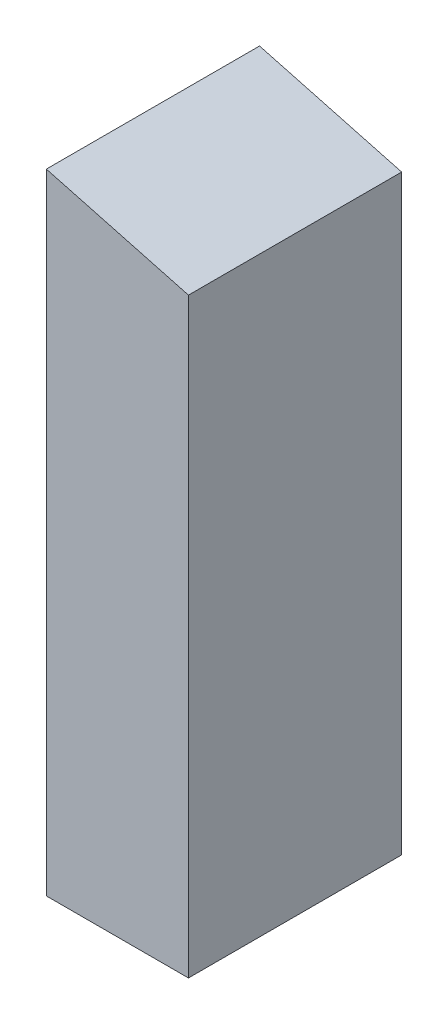
ISO-10303-21;
HEADER;
FILE_DESCRIPTION(('STEP AP214'),'2;1');
FILE_NAME('part.step','',(''),(''),'','','');
FILE_SCHEMA(('AUTOMOTIVE_DESIGN { 1 0 10303 214 1 1 1 1 }'));
ENDSEC;
DATA;
#1=APPLICATION_CONTEXT('core data for automotive mechanical design processes');
#2=APPLICATION_PROTOCOL_DEFINITION('international standard','automotive_design',2000,#1);
#3=PRODUCT_CONTEXT('',#1,'mechanical');
#4=PRODUCT('Part','Part','',(#3));
#5=PRODUCT_RELATED_PRODUCT_CATEGORY('part','',(#4));
#6=PRODUCT_DEFINITION_FORMATION('','',#4);
#7=PRODUCT_DEFINITION_CONTEXT('part definition',#1,'design');
#8=PRODUCT_DEFINITION('design','',#6,#7);
#9=PRODUCT_DEFINITION_SHAPE('','',#8);
#10=(LENGTH_UNIT() NAMED_UNIT(*) SI_UNIT(.MILLI.,.METRE.));
#11=(NAMED_UNIT(*) PLANE_ANGLE_UNIT() SI_UNIT($,.RADIAN.));
#12=(NAMED_UNIT(*) SI_UNIT($,.STERADIAN.) SOLID_ANGLE_UNIT());
#13=UNCERTAINTY_MEASURE_WITH_UNIT(LENGTH_MEASURE(1.E-05),#10,'distance_accuracy_value','');
#14=(GEOMETRIC_REPRESENTATION_CONTEXT(3) GLOBAL_UNCERTAINTY_ASSIGNED_CONTEXT((#13)) GLOBAL_UNIT_ASSIGNED_CONTEXT((#10,
#11,#12)) REPRESENTATION_CONTEXT('',''));
#15=CARTESIAN_POINT('',(0.,0.,0.));
#16=DIRECTION('',(0.,0.,1.));
#17=DIRECTION('',(1.,0.,0.));
#18=AXIS2_PLACEMENT_3D('',#15,#16,#17);
#19=CARTESIAN_POINT('',(0.,0.,76.2));
#20=DIRECTION('',(0.,1.,0.));
#21=DIRECTION('',(0.,0.,1.));
#22=AXIS2_PLACEMENT_3D('',#19,#20,#21);
#23=PLANE('',#22);
#24=DIRECTION('',(1.,0.,0.));
#25=VECTOR('',#24,1.);
#26=CARTESIAN_POINT('',(0.,0.,0.));
#27=LINE('',#26,#25);
#28=CARTESIAN_POINT('',(0.,0.,0.));
#29=VERTEX_POINT('',#28);
#30=CARTESIAN_POINT('',(50.8,0.,0.));
#31=VERTEX_POINT('',#30);
#32=EDGE_CURVE('E100',#29,#31,#27,.T.);
#33=ORIENTED_EDGE('',*,*,#32,.T.);
#34=DIRECTION('',(0.,0.,-1.));
#35=VECTOR('',#34,1.);
#36=CARTESIAN_POINT('',(50.8,0.,76.2));
#37=LINE('',#36,#35);
#38=CARTESIAN_POINT('',(50.8,0.,76.2));
#39=VERTEX_POINT('',#38);
#40=EDGE_CURVE('E11',#39,#31,#37,.T.);
#41=ORIENTED_EDGE('',*,*,#40,.F.);
#42=DIRECTION('',(1.,0.,0.));
#43=VECTOR('',#42,1.);
#44=CARTESIAN_POINT('',(0.,0.,76.2));
#45=LINE('',#44,#43);
#46=CARTESIAN_POINT('',(0.,0.,76.2));
#47=VERTEX_POINT('',#46);
#48=EDGE_CURVE('E88',#47,#39,#45,.T.);
#49=ORIENTED_EDGE('',*,*,#48,.F.);
#50=DIRECTION('',(0.,0.,-1.));
#51=VECTOR('',#50,1.);
#52=CARTESIAN_POINT('',(0.,0.,76.2));
#53=LINE('',#52,#51);
#54=EDGE_CURVE('E96',#47,#29,#53,.T.);
#55=ORIENTED_EDGE('',*,*,#54,.T.);
#56=EDGE_LOOP('',(#33,#41,#49,#55));
#57=FACE_BOUND('',#56,.T.);
#58=ADVANCED_FACE('F37',(#57),#23,.F.);
#59=CARTESIAN_POINT('',(50.8,0.,76.2));
#60=DIRECTION('',(-1.,0.,0.));
#61=DIRECTION('',(0.,0.,1.));
#62=AXIS2_PLACEMENT_3D('',#59,#60,#61);
#63=PLANE('',#62);
#64=DIRECTION('',(0.,1.,0.));
#65=VECTOR('',#64,1.);
#66=CARTESIAN_POINT('',(50.8,0.,0.));
#67=LINE('',#66,#65);
#68=CARTESIAN_POINT('',(50.8,211.388181024499,0.));
#69=VERTEX_POINT('',#68);
#70=EDGE_CURVE('E92',#31,#69,#67,.T.);
#71=ORIENTED_EDGE('',*,*,#70,.T.);
#72=DIRECTION('',(0.,0.,-1.));
#73=VECTOR('',#72,1.);
#74=CARTESIAN_POINT('',(50.8,211.388181024499,76.2));
#75=LINE('',#74,#73);
#76=CARTESIAN_POINT('',(50.8,211.388181024499,76.2));
#77=VERTEX_POINT('',#76);
#78=EDGE_CURVE('E45',#77,#69,#75,.T.);
#79=ORIENTED_EDGE('',*,*,#78,.F.);
#80=DIRECTION('',(0.,1.,0.));
#81=VECTOR('',#80,1.);
#82=CARTESIAN_POINT('',(50.8,0.,76.2));
#83=LINE('',#82,#81);
#84=EDGE_CURVE('E83',#39,#77,#83,.T.);
#85=ORIENTED_EDGE('',*,*,#84,.F.);
#86=ORIENTED_EDGE('',*,*,#40,.T.);
#87=EDGE_LOOP('',(#71,#79,#85,#86));
#88=FACE_BOUND('',#87,.T.);
#89=ADVANCED_FACE('F91',(#88),#63,.F.);
#90=CARTESIAN_POINT('',(0.,225.,76.2));
#91=DIRECTION('',(-0.258819045102525,-0.965925826289067,0.));
#92=DIRECTION('',(0.965925826289067,-0.258819045102525,0.));
#93=AXIS2_PLACEMENT_3D('',#90,#91,#92);
#94=PLANE('',#93);
#95=DIRECTION('',(-0.965925826289067,0.258819045102525,0.));
#96=VECTOR('',#95,1.);
#97=CARTESIAN_POINT('',(0.,225.,0.));
#98=LINE('',#97,#96);
#99=CARTESIAN_POINT('',(0.,225.,0.));
#100=VERTEX_POINT('',#99);
#101=EDGE_CURVE('E70',#69,#100,#98,.T.);
#102=ORIENTED_EDGE('',*,*,#101,.T.);
#103=DIRECTION('',(0.,0.,-1.));
#104=VECTOR('',#103,1.);
#105=CARTESIAN_POINT('',(0.,225.,76.2));
#106=LINE('',#105,#104);
#107=CARTESIAN_POINT('',(0.,225.,76.2));
#108=VERTEX_POINT('',#107);
#109=EDGE_CURVE('E93',#108,#100,#106,.T.);
#110=ORIENTED_EDGE('',*,*,#109,.F.);
#111=DIRECTION('',(-0.965925826289067,0.258819045102525,0.));
#112=VECTOR('',#111,1.);
#113=CARTESIAN_POINT('',(0.,225.,76.2));
#114=LINE('',#113,#112);
#115=EDGE_CURVE('E86',#77,#108,#114,.T.);
#116=ORIENTED_EDGE('',*,*,#115,.F.);
#117=ORIENTED_EDGE('',*,*,#78,.T.);
#118=EDGE_LOOP('',(#102,#110,#116,#117));
#119=FACE_BOUND('',#118,.T.);
#120=ADVANCED_FACE('F94',(#119),#94,.F.);
#121=CARTESIAN_POINT('',(0.,0.,76.2));
#122=DIRECTION('',(1.,0.,0.));
#123=DIRECTION('',(0.,0.,-1.));
#124=AXIS2_PLACEMENT_3D('',#121,#122,#123);
#125=PLANE('',#124);
#126=DIRECTION('',(0.,-1.,0.));
#127=VECTOR('',#126,1.);
#128=CARTESIAN_POINT('',(0.,0.,0.));
#129=LINE('',#128,#127);
#130=EDGE_CURVE('E76',#100,#29,#129,.T.);
#131=ORIENTED_EDGE('',*,*,#130,.T.);
#132=ORIENTED_EDGE('',*,*,#54,.F.);
#133=DIRECTION('',(0.,-1.,0.));
#134=VECTOR('',#133,1.);
#135=CARTESIAN_POINT('',(0.,0.,76.2));
#136=LINE('',#135,#134);
#137=EDGE_CURVE('E53',#108,#47,#136,.T.);
#138=ORIENTED_EDGE('',*,*,#137,.F.);
#139=ORIENTED_EDGE('',*,*,#109,.T.);
#140=EDGE_LOOP('',(#131,#132,#138,#139));
#141=FACE_BOUND('',#140,.T.);
#142=ADVANCED_FACE('F107',(#141),#125,.F.);
#143=CARTESIAN_POINT('',(0.,0.,76.2));
#144=DIRECTION('',(0.,0.,1.));
#145=DIRECTION('',(1.,0.,0.));
#146=AXIS2_PLACEMENT_3D('',#143,#144,#145);
#147=PLANE('',#146);
#148=ORIENTED_EDGE('',*,*,#48,.T.);
#149=ORIENTED_EDGE('',*,*,#84,.T.);
#150=ORIENTED_EDGE('',*,*,#115,.T.);
#151=ORIENTED_EDGE('',*,*,#137,.T.);
#152=EDGE_LOOP('',(#148,#149,#150,#151));
#153=FACE_BOUND('',#152,.T.);
#154=ADVANCED_FACE('F84',(#153),#147,.T.);
#155=CARTESIAN_POINT('',(0.,0.,0.));
#156=DIRECTION('',(0.,0.,1.));
#157=DIRECTION('',(1.,0.,0.));
#158=AXIS2_PLACEMENT_3D('',#155,#156,#157);
#159=PLANE('',#158);
#160=ORIENTED_EDGE('',*,*,#32,.F.);
#161=ORIENTED_EDGE('',*,*,#130,.F.);
#162=ORIENTED_EDGE('',*,*,#101,.F.);
#163=ORIENTED_EDGE('',*,*,#70,.F.);
#164=EDGE_LOOP('',(#160,#161,#162,#163));
#165=FACE_BOUND('',#164,.T.);
#166=ADVANCED_FACE('F110',(#165),#159,.F.);
#167=CLOSED_SHELL('',(#58,#89,#120,#142,#154,#166));
#168=MANIFOLD_SOLID_BREP('B2',#167);
#169=ADVANCED_BREP_SHAPE_REPRESENTATION('',(#18,#168),#14);
#170=SHAPE_DEFINITION_REPRESENTATION(#9,#169);
ENDSEC;
END-ISO-10303-21;
